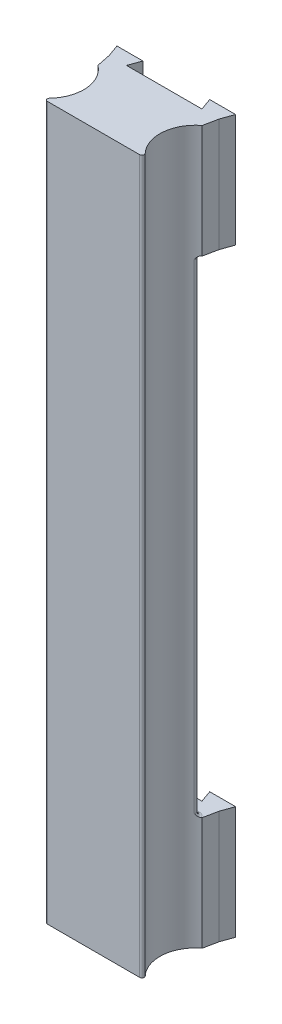
ISO-10303-21;
HEADER;
FILE_DESCRIPTION(('STEP AP214'),'2;1');
FILE_NAME('part.step','',(''),(''),'','','');
FILE_SCHEMA(('AUTOMOTIVE_DESIGN { 1 0 10303 214 1 1 1 1 }'));
ENDSEC;
DATA;
#1=APPLICATION_CONTEXT('core data for automotive mechanical design processes');
#2=APPLICATION_PROTOCOL_DEFINITION('international standard','automotive_design',2000,#1);
#3=PRODUCT_CONTEXT('',#1,'mechanical');
#4=PRODUCT('Part','Part','',(#3));
#5=PRODUCT_RELATED_PRODUCT_CATEGORY('part','',(#4));
#6=PRODUCT_DEFINITION_FORMATION('','',#4);
#7=PRODUCT_DEFINITION_CONTEXT('part definition',#1,'design');
#8=PRODUCT_DEFINITION('design','',#6,#7);
#9=PRODUCT_DEFINITION_SHAPE('','',#8);
#10=(LENGTH_UNIT() NAMED_UNIT(*) SI_UNIT(.MILLI.,.METRE.));
#11=(NAMED_UNIT(*) PLANE_ANGLE_UNIT() SI_UNIT($,.RADIAN.));
#12=(NAMED_UNIT(*) SI_UNIT($,.STERADIAN.) SOLID_ANGLE_UNIT());
#13=UNCERTAINTY_MEASURE_WITH_UNIT(LENGTH_MEASURE(1.E-05),#10,'distance_accuracy_value','');
#14=(GEOMETRIC_REPRESENTATION_CONTEXT(3) GLOBAL_UNCERTAINTY_ASSIGNED_CONTEXT((#13)) GLOBAL_UNIT_ASSIGNED_CONTEXT((#10,
#11,#12)) REPRESENTATION_CONTEXT('',''));
#15=CARTESIAN_POINT('',(0.,0.,0.));
#16=DIRECTION('',(0.,0.,1.));
#17=DIRECTION('',(1.,0.,0.));
#18=AXIS2_PLACEMENT_3D('',#15,#16,#17);
#19=CARTESIAN_POINT('',(-5.24524877236931,21.5,-2.5));
#20=DIRECTION('',(0.,0.,1.));
#21=DIRECTION('',(1.,0.,0.));
#22=AXIS2_PLACEMENT_3D('',#19,#20,#21);
#23=PLANE('',#22);
#24=DIRECTION('',(0.,1.,0.));
#25=VECTOR('',#24,1.);
#26=CARTESIAN_POINT('',(4.085,-22.1229962658299,-2.5));
#27=LINE('',#26,#25);
#28=CARTESIAN_POINT('',(4.085,-21.2,-2.5));
#29=VERTEX_POINT('',#28);
#30=CARTESIAN_POINT('',(4.085,21.2,-2.5));
#31=VERTEX_POINT('',#30);
#32=EDGE_CURVE('E260',#29,#31,#27,.T.);
#33=ORIENTED_EDGE('',*,*,#32,.F.);
#34=DIRECTION('',(1.,0.,0.));
#35=VECTOR('',#34,1.);
#36=CARTESIAN_POINT('',(-4.085,-21.2,-2.5));
#37=LINE('',#36,#35);
#38=CARTESIAN_POINT('',(-4.085,-21.2,-2.5));
#39=VERTEX_POINT('',#38);
#40=EDGE_CURVE('E366',#29,#39,#37,.F.);
#41=ORIENTED_EDGE('',*,*,#40,.T.);
#42=DIRECTION('',(0.,1.,0.));
#43=VECTOR('',#42,1.);
#44=CARTESIAN_POINT('',(-4.085,-22.1229962658299,-2.5));
#45=LINE('',#44,#43);
#46=CARTESIAN_POINT('',(-4.085,21.2,-2.5));
#47=VERTEX_POINT('',#46);
#48=EDGE_CURVE('E688',#39,#47,#45,.T.);
#49=ORIENTED_EDGE('',*,*,#48,.T.);
#50=DIRECTION('',(1.,0.,0.));
#51=VECTOR('',#50,1.);
#52=CARTESIAN_POINT('',(4.085,21.2,-2.5));
#53=LINE('',#52,#51);
#54=EDGE_CURVE('E363',#47,#31,#53,.T.);
#55=ORIENTED_EDGE('',*,*,#54,.T.);
#56=EDGE_LOOP('',(#33,#41,#49,#55));
#57=FACE_BOUND('',#56,.T.);
#58=ADVANCED_FACE('F38',(#57),#23,.F.);
#59=CARTESIAN_POINT('',(-4.60838032363797,31.5,-2.5));
#60=DIRECTION('',(-0.979637559789104,0.,0.200774130431311));
#61=DIRECTION('',(0.200774130431311,0.,0.979637559789104));
#62=AXIS2_PLACEMENT_3D('',#59,#60,#61);
#63=PLANE('',#62);
#64=DIRECTION('',(0.200774130431311,0.,0.979637559789104));
#65=VECTOR('',#64,1.);
#66=CARTESIAN_POINT('',(-4.60838032363797,-21.5,-2.5));
#67=LINE('',#66,#65);
#68=CARTESIAN_POINT('',(-4.86456452210129,-21.5,-3.75));
#69=VERTEX_POINT('',#68);
#70=CARTESIAN_POINT('',(-4.60838032363797,-21.5,-2.5));
#71=VERTEX_POINT('',#70);
#72=EDGE_CURVE('E272',#69,#71,#67,.T.);
#73=ORIENTED_EDGE('',*,*,#72,.F.);
#74=DIRECTION('',(0.,-1.,0.));
#75=VECTOR('',#74,1.);
#76=CARTESIAN_POINT('',(-4.86456452210129,31.5,-3.75));
#77=LINE('',#76,#75);
#78=CARTESIAN_POINT('',(-4.86456452210129,-31.5,-3.75));
#79=VERTEX_POINT('',#78);
#80=EDGE_CURVE('E325',#69,#79,#77,.T.);
#81=ORIENTED_EDGE('',*,*,#80,.T.);
#82=DIRECTION('',(-0.200774130431311,0.,-0.979637559789104));
#83=VECTOR('',#82,1.);
#84=CARTESIAN_POINT('',(-4.60838032363797,-31.5,-2.5));
#85=LINE('',#84,#83);
#86=CARTESIAN_POINT('',(-4.60838032363797,-31.5,-2.5));
#87=VERTEX_POINT('',#86);
#88=EDGE_CURVE('E522',#87,#79,#85,.T.);
#89=ORIENTED_EDGE('',*,*,#88,.F.);
#90=DIRECTION('',(0.,-1.,0.));
#91=VECTOR('',#90,1.);
#92=CARTESIAN_POINT('',(-4.60838032363797,31.5,-2.5));
#93=LINE('',#92,#91);
#94=EDGE_CURVE('E574',#71,#87,#93,.T.);
#95=ORIENTED_EDGE('',*,*,#94,.F.);
#96=EDGE_LOOP('',(#73,#81,#89,#95));
#97=FACE_BOUND('',#96,.T.);
#98=ADVANCED_FACE('F428',(#97),#63,.T.);
#99=CARTESIAN_POINT('',(4.60838032363797,31.5,-2.5));
#100=DIRECTION('',(-0.979637559789105,0.,-0.200774130431308));
#101=DIRECTION('',(-0.200774130431308,0.,0.979637559789105));
#102=AXIS2_PLACEMENT_3D('',#99,#100,#101);
#103=PLANE('',#102);
#104=DIRECTION('',(0.,-1.,0.));
#105=VECTOR('',#104,1.);
#106=CARTESIAN_POINT('',(4.86456452210129,31.5,-3.75));
#107=LINE('',#106,#105);
#108=CARTESIAN_POINT('',(4.86456452210129,-21.5,-3.75));
#109=VERTEX_POINT('',#108);
#110=CARTESIAN_POINT('',(4.86456452210129,-31.5,-3.75));
#111=VERTEX_POINT('',#110);
#112=EDGE_CURVE('E290',#109,#111,#107,.T.);
#113=ORIENTED_EDGE('',*,*,#112,.F.);
#114=DIRECTION('',(-0.200774130431308,0.,0.979637559789105));
#115=VECTOR('',#114,1.);
#116=CARTESIAN_POINT('',(4.60838032363797,-21.5,-2.5));
#117=LINE('',#116,#115);
#118=CARTESIAN_POINT('',(4.60838032363797,-21.5,-2.5));
#119=VERTEX_POINT('',#118);
#120=EDGE_CURVE('E479',#109,#119,#117,.T.);
#121=ORIENTED_EDGE('',*,*,#120,.T.);
#122=DIRECTION('',(0.,-1.,0.));
#123=VECTOR('',#122,1.);
#124=CARTESIAN_POINT('',(4.60838032363797,31.5,-2.5));
#125=LINE('',#124,#123);
#126=CARTESIAN_POINT('',(4.60838032363797,-31.5,-2.5));
#127=VERTEX_POINT('',#126);
#128=EDGE_CURVE('E278',#119,#127,#125,.T.);
#129=ORIENTED_EDGE('',*,*,#128,.T.);
#130=DIRECTION('',(0.200774130431308,0.,-0.979637559789105));
#131=VECTOR('',#130,1.);
#132=CARTESIAN_POINT('',(4.60838032363797,-31.5,-2.5));
#133=LINE('',#132,#131);
#134=EDGE_CURVE('E554',#127,#111,#133,.T.);
#135=ORIENTED_EDGE('',*,*,#134,.T.);
#136=EDGE_LOOP('',(#113,#121,#129,#135));
#137=FACE_BOUND('',#136,.T.);
#138=ADVANCED_FACE('F434',(#137),#103,.F.);
#139=CARTESIAN_POINT('',(5.24524877236931,31.5,-4.81591590075046));
#140=DIRECTION('',(0.941741911594837,0.,0.336336396998157));
#141=DIRECTION('',(0.336336396998157,0.,-0.941741911594837));
#142=AXIS2_PLACEMENT_3D('',#139,#140,#141);
#143=PLANE('',#142);
#144=DIRECTION('',(0.336336396998157,0.,-0.941741911594837));
#145=VECTOR('',#144,1.);
#146=CARTESIAN_POINT('',(5.24524877236931,-21.5,-4.81591590075046));
#147=LINE('',#146,#145);
#148=CARTESIAN_POINT('',(5.24524877236931,-21.5,-4.81591590075046));
#149=VERTEX_POINT('',#148);
#150=EDGE_CURVE('E647',#109,#149,#147,.T.);
#151=ORIENTED_EDGE('',*,*,#150,.F.);
#152=ORIENTED_EDGE('',*,*,#112,.T.);
#153=DIRECTION('',(-0.336336396998157,0.,0.941741911594837));
#154=VECTOR('',#153,1.);
#155=CARTESIAN_POINT('',(5.24524877236931,-31.5,-4.81591590075046));
#156=LINE('',#155,#154);
#157=CARTESIAN_POINT('',(5.24524877236931,-31.5,-4.81591590075046));
#158=VERTEX_POINT('',#157);
#159=EDGE_CURVE('E550',#158,#111,#156,.T.);
#160=ORIENTED_EDGE('',*,*,#159,.F.);
#161=DIRECTION('',(0.,-1.,0.));
#162=VECTOR('',#161,1.);
#163=CARTESIAN_POINT('',(5.24524877236931,31.5,-4.81591590075046));
#164=LINE('',#163,#162);
#165=EDGE_CURVE('E295',#149,#158,#164,.T.);
#166=ORIENTED_EDGE('',*,*,#165,.F.);
#167=EDGE_LOOP('',(#151,#152,#160,#166));
#168=FACE_BOUND('',#167,.T.);
#169=ADVANCED_FACE('F645',(#168),#143,.T.);
#170=CARTESIAN_POINT('',(2.95475122763068,31.5,-4.81591590075046));
#171=DIRECTION('',(0.,0.,-1.));
#172=DIRECTION('',(-1.,0.,0.));
#173=AXIS2_PLACEMENT_3D('',#170,#171,#172);
#174=PLANE('',#173);
#175=DIRECTION('',(1.,0.,0.));
#176=VECTOR('',#175,1.);
#177=CARTESIAN_POINT('',(-5.24524877236931,-21.5,-4.81591590075046));
#178=LINE('',#177,#176);
#179=CARTESIAN_POINT('',(2.95475122763068,-21.5,-4.81591590075046));
#180=VERTEX_POINT('',#179);
#181=EDGE_CURVE('E641',#180,#149,#178,.T.);
#182=ORIENTED_EDGE('',*,*,#181,.T.);
#183=ORIENTED_EDGE('',*,*,#165,.T.);
#184=DIRECTION('',(1.,0.,0.));
#185=VECTOR('',#184,1.);
#186=CARTESIAN_POINT('',(2.95475122763068,-31.5,-4.81591590075046));
#187=LINE('',#186,#185);
#188=CARTESIAN_POINT('',(2.95475122763068,-31.5,-4.81591590075046));
#189=VERTEX_POINT('',#188);
#190=EDGE_CURVE('E546',#189,#158,#187,.T.);
#191=ORIENTED_EDGE('',*,*,#190,.F.);
#192=DIRECTION('',(0.,-1.,0.));
#193=VECTOR('',#192,1.);
#194=CARTESIAN_POINT('',(2.95475122763068,31.5,-4.81591590075046));
#195=LINE('',#194,#193);
#196=EDGE_CURVE('E300',#180,#189,#195,.T.);
#197=ORIENTED_EDGE('',*,*,#196,.F.);
#198=EDGE_LOOP('',(#182,#183,#191,#197));
#199=FACE_BOUND('',#198,.T.);
#200=ADVANCED_FACE('F638',(#199),#174,.T.);
#201=CARTESIAN_POINT('',(3.33543547789871,31.5,-3.75));
#202=DIRECTION('',(-0.941741911594837,0.,0.336336396998157));
#203=DIRECTION('',(0.336336396998157,0.,0.941741911594837));
#204=AXIS2_PLACEMENT_3D('',#201,#202,#203);
#205=PLANE('',#204);
#206=DIRECTION('',(0.336336396998157,0.,0.941741911594837));
#207=VECTOR('',#206,1.);
#208=CARTESIAN_POINT('',(3.33543547789871,-21.5,-3.75));
#209=LINE('',#208,#207);
#210=CARTESIAN_POINT('',(3.33543547789871,-21.5,-3.75));
#211=VERTEX_POINT('',#210);
#212=EDGE_CURVE('E634',#180,#211,#209,.T.);
#213=ORIENTED_EDGE('',*,*,#212,.F.);
#214=ORIENTED_EDGE('',*,*,#196,.T.);
#215=DIRECTION('',(-0.336336396998157,0.,-0.941741911594837));
#216=VECTOR('',#215,1.);
#217=CARTESIAN_POINT('',(3.33543547789871,-31.5,-3.75));
#218=LINE('',#217,#216);
#219=CARTESIAN_POINT('',(3.33543547789871,-31.5,-3.75));
#220=VERTEX_POINT('',#219);
#221=EDGE_CURVE('E542',#220,#189,#218,.T.);
#222=ORIENTED_EDGE('',*,*,#221,.F.);
#223=DIRECTION('',(0.,-1.,0.));
#224=VECTOR('',#223,1.);
#225=CARTESIAN_POINT('',(3.33543547789871,31.5,-3.75));
#226=LINE('',#225,#224);
#227=EDGE_CURVE('E305',#211,#220,#226,.T.);
#228=ORIENTED_EDGE('',*,*,#227,.F.);
#229=EDGE_LOOP('',(#213,#214,#222,#228));
#230=FACE_BOUND('',#229,.T.);
#231=ADVANCED_FACE('F632',(#230),#205,.T.);
#232=CARTESIAN_POINT('',(-3.33543547789871,31.5,-3.75));
#233=DIRECTION('',(0.,0.,-1.));
#234=DIRECTION('',(-1.,0.,0.));
#235=AXIS2_PLACEMENT_3D('',#232,#233,#234);
#236=PLANE('',#235);
#237=DIRECTION('',(-1.,0.,0.));
#238=VECTOR('',#237,1.);
#239=CARTESIAN_POINT('',(-3.33543547789871,-21.5,-3.75));
#240=LINE('',#239,#238);
#241=CARTESIAN_POINT('',(-3.33543547789871,-21.5,-3.75));
#242=VERTEX_POINT('',#241);
#243=EDGE_CURVE('E655',#211,#242,#240,.T.);
#244=ORIENTED_EDGE('',*,*,#243,.F.);
#245=ORIENTED_EDGE('',*,*,#227,.T.);
#246=DIRECTION('',(1.,0.,0.));
#247=VECTOR('',#246,1.);
#248=CARTESIAN_POINT('',(-3.33543547789871,-31.5,-3.75));
#249=LINE('',#248,#247);
#250=CARTESIAN_POINT('',(-3.33543547789871,-31.5,-3.75));
#251=VERTEX_POINT('',#250);
#252=EDGE_CURVE('E538',#251,#220,#249,.T.);
#253=ORIENTED_EDGE('',*,*,#252,.F.);
#254=DIRECTION('',(0.,-1.,0.));
#255=VECTOR('',#254,1.);
#256=CARTESIAN_POINT('',(-3.33543547789871,31.5,-3.75));
#257=LINE('',#256,#255);
#258=EDGE_CURVE('E310',#242,#251,#257,.T.);
#259=ORIENTED_EDGE('',*,*,#258,.F.);
#260=EDGE_LOOP('',(#244,#245,#253,#259));
#261=FACE_BOUND('',#260,.T.);
#262=ADVANCED_FACE('F626',(#261),#236,.T.);
#263=CARTESIAN_POINT('',(-2.95475122763069,31.5,-4.81591590075046));
#264=DIRECTION('',(0.941741911594837,0.,0.336336396998157));
#265=DIRECTION('',(0.336336396998157,0.,-0.941741911594837));
#266=AXIS2_PLACEMENT_3D('',#263,#264,#265);
#267=PLANE('',#266);
#268=DIRECTION('',(0.336336396998157,0.,-0.941741911594837));
#269=VECTOR('',#268,1.);
#270=CARTESIAN_POINT('',(-2.95475122763069,-21.5,-4.81591590075046));
#271=LINE('',#270,#269);
#272=CARTESIAN_POINT('',(-2.95475122763069,-21.5,-4.81591590075046));
#273=VERTEX_POINT('',#272);
#274=EDGE_CURVE('E622',#242,#273,#271,.T.);
#275=ORIENTED_EDGE('',*,*,#274,.F.);
#276=ORIENTED_EDGE('',*,*,#258,.T.);
#277=DIRECTION('',(-0.336336396998157,0.,0.941741911594837));
#278=VECTOR('',#277,1.);
#279=CARTESIAN_POINT('',(-2.95475122763069,-31.5,-4.81591590075046));
#280=LINE('',#279,#278);
#281=CARTESIAN_POINT('',(-2.95475122763069,-31.5,-4.81591590075046));
#282=VERTEX_POINT('',#281);
#283=EDGE_CURVE('E534',#282,#251,#280,.T.);
#284=ORIENTED_EDGE('',*,*,#283,.F.);
#285=DIRECTION('',(0.,-1.,0.));
#286=VECTOR('',#285,1.);
#287=CARTESIAN_POINT('',(-2.95475122763069,31.5,-4.81591590075046));
#288=LINE('',#287,#286);
#289=EDGE_CURVE('E315',#273,#282,#288,.T.);
#290=ORIENTED_EDGE('',*,*,#289,.F.);
#291=EDGE_LOOP('',(#275,#276,#284,#290));
#292=FACE_BOUND('',#291,.T.);
#293=ADVANCED_FACE('F619',(#292),#267,.T.);
#294=CARTESIAN_POINT('',(-5.24524877236931,31.5,-4.81591590075046));
#295=DIRECTION('',(0.,0.,-1.));
#296=DIRECTION('',(-1.,0.,0.));
#297=AXIS2_PLACEMENT_3D('',#294,#295,#296);
#298=PLANE('',#297);
#299=CARTESIAN_POINT('',(-5.24524877236931,-21.5,-4.81591590075046));
#300=VERTEX_POINT('',#299);
#301=EDGE_CURVE('E615',#300,#273,#178,.T.);
#302=ORIENTED_EDGE('',*,*,#301,.T.);
#303=ORIENTED_EDGE('',*,*,#289,.T.);
#304=DIRECTION('',(1.,0.,0.));
#305=VECTOR('',#304,1.);
#306=CARTESIAN_POINT('',(-5.24524877236931,-31.5,-4.81591590075046));
#307=LINE('',#306,#305);
#308=CARTESIAN_POINT('',(-5.24524877236931,-31.5,-4.81591590075046));
#309=VERTEX_POINT('',#308);
#310=EDGE_CURVE('E530',#309,#282,#307,.T.);
#311=ORIENTED_EDGE('',*,*,#310,.F.);
#312=DIRECTION('',(0.,-1.,0.));
#313=VECTOR('',#312,1.);
#314=CARTESIAN_POINT('',(-5.24524877236931,31.5,-4.81591590075046));
#315=LINE('',#314,#313);
#316=EDGE_CURVE('E320',#300,#309,#315,.T.);
#317=ORIENTED_EDGE('',*,*,#316,.F.);
#318=EDGE_LOOP('',(#302,#303,#311,#317));
#319=FACE_BOUND('',#318,.T.);
#320=ADVANCED_FACE('F613',(#319),#298,.T.);
#321=CARTESIAN_POINT('',(-4.86456452210129,31.5,-3.75));
#322=DIRECTION('',(-0.941741911594837,0.,0.336336396998156));
#323=DIRECTION('',(0.336336396998156,0.,0.941741911594838));
#324=AXIS2_PLACEMENT_3D('',#321,#322,#323);
#325=PLANE('',#324);
#326=DIRECTION('',(0.336336396998156,0.,0.941741911594838));
#327=VECTOR('',#326,1.);
#328=CARTESIAN_POINT('',(-4.86456452210129,-21.5,-3.75));
#329=LINE('',#328,#327);
#330=EDGE_CURVE('E329',#300,#69,#329,.T.);
#331=ORIENTED_EDGE('',*,*,#330,.F.);
#332=ORIENTED_EDGE('',*,*,#316,.T.);
#333=DIRECTION('',(-0.336336396998156,0.,-0.941741911594837));
#334=VECTOR('',#333,1.);
#335=CARTESIAN_POINT('',(-4.86456452210129,-31.5,-3.75));
#336=LINE('',#335,#334);
#337=EDGE_CURVE('E526',#79,#309,#336,.T.);
#338=ORIENTED_EDGE('',*,*,#337,.F.);
#339=ORIENTED_EDGE('',*,*,#80,.F.);
#340=EDGE_LOOP('',(#331,#332,#338,#339));
#341=FACE_BOUND('',#340,.T.);
#342=ADVANCED_FACE('F455',(#341),#325,.T.);
#343=DIRECTION('',(-0.200774130431311,0.,-0.979637559789104));
#344=VECTOR('',#343,1.);
#345=CARTESIAN_POINT('',(-4.60838032363797,21.5,-2.5));
#346=LINE('',#345,#344);
#347=CARTESIAN_POINT('',(-4.60838032363796,21.5,-2.5));
#348=VERTEX_POINT('',#347);
#349=CARTESIAN_POINT('',(-4.86456452210129,21.5,-3.75));
#350=VERTEX_POINT('',#349);
#351=EDGE_CURVE('E675',#348,#350,#346,.T.);
#352=ORIENTED_EDGE('',*,*,#351,.F.);
#353=CARTESIAN_POINT('',(-4.60838032363797,31.5,-2.5));
#354=VERTEX_POINT('',#353);
#355=EDGE_CURVE('E330',#354,#348,#93,.T.);
#356=ORIENTED_EDGE('',*,*,#355,.F.);
#357=DIRECTION('',(-0.200774130431311,0.,-0.979637559789104));
#358=VECTOR('',#357,1.);
#359=CARTESIAN_POINT('',(-4.60838032363797,31.5,-2.5));
#360=LINE('',#359,#358);
#361=CARTESIAN_POINT('',(-4.86456452210129,31.5,-3.75));
#362=VERTEX_POINT('',#361);
#363=EDGE_CURVE('E459',#354,#362,#360,.T.);
#364=ORIENTED_EDGE('',*,*,#363,.T.);
#365=EDGE_CURVE('E321',#362,#350,#77,.T.);
#366=ORIENTED_EDGE('',*,*,#365,.T.);
#367=EDGE_LOOP('',(#352,#356,#364,#366));
#368=FACE_BOUND('',#367,.T.);
#369=ADVANCED_FACE('F396',(#368),#63,.T.);
#370=CARTESIAN_POINT('',(-6.5,31.5,0.));
#371=DIRECTION('',(0.,-1.,0.));
#372=DIRECTION('',(0.,0.,-1.));
#373=AXIS2_PLACEMENT_3D('',#370,#371,#372);
#374=CYLINDRICAL_SURFACE('',#373,3.135);
#375=DIRECTION('',(0.,1.,0.));
#376=VECTOR('',#375,1.);
#377=CARTESIAN_POINT('',(-4.22982758620689,-22.1229962658299,-2.16206896551724));
#378=LINE('',#377,#376);
#379=CARTESIAN_POINT('',(-4.22982758620689,-21.2,-2.16206896551724));
#380=VERTEX_POINT('',#379);
#381=CARTESIAN_POINT('',(-4.22982758620689,21.2,-2.16206896551724));
#382=VERTEX_POINT('',#381);
#383=EDGE_CURVE('E261',#380,#382,#378,.T.);
#384=ORIENTED_EDGE('',*,*,#383,.F.);
#385=CARTESIAN_POINT('',(-4.55827298851918,-21.5,-2.4612844640321));
#386=CARTESIAN_POINT('',(-4.54143455661008,-21.5000243216641,-2.44800990043269));
#387=CARTESIAN_POINT('',(-4.52480466585507,-21.4979611893721,-2.43460119558574));
#388=CARTESIAN_POINT('',(-4.49249352260843,-21.4901906143775,-2.40802067472048));
#389=CARTESIAN_POINT('',(-4.47680444527255,-21.4845198297719,-2.39484783075812));
#390=CARTESIAN_POINT('',(-4.443279878637,-21.4684779359178,-2.36616138621974));
#391=CARTESIAN_POINT('',(-4.42571528292319,-21.4573549076767,-2.35075860423749));
#392=CARTESIAN_POINT('',(-4.39243428467488,-21.4314906010558,-2.32096773407384));
#393=CARTESIAN_POINT('',(-4.37672418538867,-21.4167374802418,-2.30658316946893));
#394=CARTESIAN_POINT('',(-4.33609154210771,-21.3726979943336,-2.26869725856682));
#395=CARTESIAN_POINT('',(-4.31300895219961,-21.3407641830028,-2.24637358575372));
#396=CARTESIAN_POINT('',(-4.27028426983801,-21.2734768624102,-2.20397485771387));
#397=CARTESIAN_POINT('',(-4.25065174200985,-21.2381142553406,-2.18390610761256));
#398=CARTESIAN_POINT('',(-4.23081633867057,-21.2018107001358,-2.16310678088176));
#399=CARTESIAN_POINT('',(-4.23032187928477,-21.2009053480206,-2.16258795396965));
#400=CARTESIAN_POINT('',(-4.22982758620689,-21.2,-2.16206896551724));
#401=B_SPLINE_CURVE_WITH_KNOTS('',3,(#385,#386,#387,#388,#389,#390,#391,#392,#393,#394,#395,
#396,#397,#398,#399,#400),.UNSPECIFIED.,.F.,.F.,(4,2,2,2,2,2,2,4),(0.,0.0641026630868594,
0.127564148578601,0.204767905213624,0.282226942548527,0.417304058247702,0.552749935800805,
0.556214037494701),.UNSPECIFIED.);
#402=CARTESIAN_POINT('',(-4.55827298851918,-21.5,-2.4612844640321));
#403=VERTEX_POINT('',#402);
#404=EDGE_CURVE('E369',#380,#403,#401,.F.);
#405=ORIENTED_EDGE('',*,*,#404,.T.);
#406=CARTESIAN_POINT('',(-6.5,-21.5,0.));
#407=DIRECTION('',(0.,-1.,0.));
#408=DIRECTION('',(0.,0.,-1.));
#409=AXIS2_PLACEMENT_3D('',#406,#407,#408);
#410=CIRCLE('',#409,3.135);
#411=EDGE_CURVE('E687',#71,#403,#410,.T.);
#412=ORIENTED_EDGE('',*,*,#411,.F.);
#413=ORIENTED_EDGE('',*,*,#94,.T.);
#414=CARTESIAN_POINT('',(-6.5,-31.5,0.));
#415=DIRECTION('',(0.,-1.,0.));
#416=DIRECTION('',(0.,0.,-1.));
#417=AXIS2_PLACEMENT_3D('',#414,#415,#416);
#418=CIRCLE('',#417,3.135);
#419=CARTESIAN_POINT('',(-4.22982758620689,-31.5,2.16206896551724));
#420=VERTEX_POINT('',#419);
#421=EDGE_CURVE('E469',#87,#420,#418,.T.);
#422=ORIENTED_EDGE('',*,*,#421,.T.);
#423=DIRECTION('',(0.,-1.,0.));
#424=VECTOR('',#423,1.);
#425=CARTESIAN_POINT('',(-4.22982758620689,31.5,2.16206896551724));
#426=LINE('',#425,#424);
#427=CARTESIAN_POINT('',(-4.22982758620689,31.5,2.16206896551724));
#428=VERTEX_POINT('',#427);
#429=EDGE_CURVE('E575',#428,#420,#426,.T.);
#430=ORIENTED_EDGE('',*,*,#429,.F.);
#431=CARTESIAN_POINT('',(-6.5,31.5,0.));
#432=DIRECTION('',(0.,-1.,0.));
#433=DIRECTION('',(0.,0.,-1.));
#434=AXIS2_PLACEMENT_3D('',#431,#432,#433);
#435=CIRCLE('',#434,3.135);
#436=EDGE_CURVE('E462',#354,#428,#435,.T.);
#437=ORIENTED_EDGE('',*,*,#436,.F.);
#438=ORIENTED_EDGE('',*,*,#355,.T.);
#439=CARTESIAN_POINT('',(-6.5,21.5,0.));
#440=DIRECTION('',(0.,1.,0.));
#441=DIRECTION('',(0.,0.,1.));
#442=AXIS2_PLACEMENT_3D('',#439,#440,#441);
#443=CIRCLE('',#442,3.135);
#444=CARTESIAN_POINT('',(-4.55827298851918,21.5,-2.4612844640321));
#445=VERTEX_POINT('',#444);
#446=EDGE_CURVE('E692',#348,#445,#443,.F.);
#447=ORIENTED_EDGE('',*,*,#446,.T.);
#448=CARTESIAN_POINT('',(-4.55827298851918,21.5,-2.4612844640321));
#449=CARTESIAN_POINT('',(-4.54143455661008,21.5000243216641,-2.44800990043269));
#450=CARTESIAN_POINT('',(-4.52480466585507,21.4979611893721,-2.43460119558573));
#451=CARTESIAN_POINT('',(-4.49249352260843,21.4901906143775,-2.40802067472048));
#452=CARTESIAN_POINT('',(-4.47680444527255,21.4845198297719,-2.39484783075812));
#453=CARTESIAN_POINT('',(-4.443279878637,21.4684779359178,-2.36616138621974));
#454=CARTESIAN_POINT('',(-4.42571528292319,21.4573549076767,-2.35075860423749));
#455=CARTESIAN_POINT('',(-4.39243428467488,21.4314906010558,-2.32096773407384));
#456=CARTESIAN_POINT('',(-4.37672418538867,21.4167374802418,-2.30658316946893));
#457=CARTESIAN_POINT('',(-4.33609154210771,21.3726979943336,-2.26869725856682));
#458=CARTESIAN_POINT('',(-4.31300895219961,21.3407641830028,-2.24637358575372));
#459=CARTESIAN_POINT('',(-4.27028426983801,21.2734768624102,-2.20397485771387));
#460=CARTESIAN_POINT('',(-4.25065174200985,21.2381142553406,-2.18390610761256));
#461=CARTESIAN_POINT('',(-4.23081633867057,21.2018107001358,-2.16310678088176));
#462=CARTESIAN_POINT('',(-4.23032187928477,21.2009053480206,-2.16258795396965));
#463=CARTESIAN_POINT('',(-4.22982758620689,21.2,-2.16206896551724));
#464=B_SPLINE_CURVE_WITH_KNOTS('',3,(#448,#449,#450,#451,#452,#453,#454,#455,#456,#457,#458,
#459,#460,#461,#462,#463),.UNSPECIFIED.,.F.,.F.,(4,2,2,2,2,2,2,4),(0.,0.0641026630868606,
0.127564148578601,0.204767905213624,0.282226942548527,0.417304058247701,0.552749935800805,
0.556214037494701),.UNSPECIFIED.);
#465=EDGE_CURVE('E49',#445,#382,#464,.T.);
#466=ORIENTED_EDGE('',*,*,#465,.T.);
#467=EDGE_LOOP('',(#384,#405,#412,#413,#422,#430,#437,#438,#447,#466));
#468=FACE_BOUND('',#467,.T.);
#469=ADVANCED_FACE('F390',(#468),#374,.F.);
#470=CARTESIAN_POINT('',(-4.085,31.5,2.3));
#471=DIRECTION('',(0.,-1.,0.));
#472=DIRECTION('',(0.,0.,-1.));
#473=AXIS2_PLACEMENT_3D('',#470,#471,#472);
#474=CYLINDRICAL_SURFACE('',#473,0.2);
#475=CARTESIAN_POINT('',(-4.085,-31.5,2.3));
#476=DIRECTION('',(0.,-1.,0.));
#477=DIRECTION('',(0.,0.,-1.));
#478=AXIS2_PLACEMENT_3D('',#475,#476,#477);
#479=CIRCLE('',#478,0.2);
#480=CARTESIAN_POINT('',(-4.085,-31.5,2.5));
#481=VERTEX_POINT('',#480);
#482=EDGE_CURVE('E476',#481,#420,#479,.T.);
#483=ORIENTED_EDGE('',*,*,#482,.F.);
#484=DIRECTION('',(0.,-1.,0.));
#485=VECTOR('',#484,1.);
#486=CARTESIAN_POINT('',(-4.085,31.5,2.5));
#487=LINE('',#486,#485);
#488=CARTESIAN_POINT('',(-4.085,31.5,2.5));
#489=VERTEX_POINT('',#488);
#490=EDGE_CURVE('E578',#489,#481,#487,.T.);
#491=ORIENTED_EDGE('',*,*,#490,.F.);
#492=CARTESIAN_POINT('',(-4.085,31.5,2.3));
#493=DIRECTION('',(0.,-1.,0.));
#494=DIRECTION('',(0.,0.,-1.));
#495=AXIS2_PLACEMENT_3D('',#492,#493,#494);
#496=CIRCLE('',#495,0.2);
#497=EDGE_CURVE('E516',#489,#428,#496,.T.);
#498=ORIENTED_EDGE('',*,*,#497,.T.);
#499=ORIENTED_EDGE('',*,*,#429,.T.);
#500=EDGE_LOOP('',(#483,#491,#498,#499));
#501=FACE_BOUND('',#500,.T.);
#502=ADVANCED_FACE('F395',(#501),#474,.T.);
#503=CARTESIAN_POINT('',(-4.085,31.5,2.5));
#504=DIRECTION('',(0.,0.,-1.));
#505=DIRECTION('',(-1.,0.,0.));
#506=AXIS2_PLACEMENT_3D('',#503,#504,#505);
#507=PLANE('',#506);
#508=DIRECTION('',(1.,0.,0.));
#509=VECTOR('',#508,1.);
#510=CARTESIAN_POINT('',(-4.085,-31.5,2.5));
#511=LINE('',#510,#509);
#512=CARTESIAN_POINT('',(4.085,-31.5,2.5));
#513=VERTEX_POINT('',#512);
#514=EDGE_CURVE('E565',#481,#513,#511,.T.);
#515=ORIENTED_EDGE('',*,*,#514,.T.);
#516=DIRECTION('',(0.,-1.,0.));
#517=VECTOR('',#516,1.);
#518=CARTESIAN_POINT('',(4.085,31.5,2.5));
#519=LINE('',#518,#517);
#520=CARTESIAN_POINT('',(4.085,31.5,2.5));
#521=VERTEX_POINT('',#520);
#522=EDGE_CURVE('E283',#521,#513,#519,.T.);
#523=ORIENTED_EDGE('',*,*,#522,.F.);
#524=DIRECTION('',(1.,0.,0.));
#525=VECTOR('',#524,1.);
#526=CARTESIAN_POINT('',(-4.085,31.5,2.5));
#527=LINE('',#526,#525);
#528=EDGE_CURVE('E513',#489,#521,#527,.T.);
#529=ORIENTED_EDGE('',*,*,#528,.F.);
#530=ORIENTED_EDGE('',*,*,#490,.T.);
#531=EDGE_LOOP('',(#515,#523,#529,#530));
#532=FACE_BOUND('',#531,.T.);
#533=ADVANCED_FACE('F596',(#532),#507,.F.);
#534=CARTESIAN_POINT('',(4.085,31.5,2.3));
#535=DIRECTION('',(0.,-1.,0.));
#536=DIRECTION('',(0.,0.,-1.));
#537=AXIS2_PLACEMENT_3D('',#534,#535,#536);
#538=CYLINDRICAL_SURFACE('',#537,0.2);
#539=CARTESIAN_POINT('',(4.085,-31.5,2.3));
#540=DIRECTION('',(0.,1.,0.));
#541=DIRECTION('',(0.,0.,1.));
#542=AXIS2_PLACEMENT_3D('',#539,#540,#541);
#543=CIRCLE('',#542,0.2);
#544=CARTESIAN_POINT('',(4.2298275862069,-31.5,2.16206896551724));
#545=VERTEX_POINT('',#544);
#546=EDGE_CURVE('E562',#513,#545,#543,.T.);
#547=ORIENTED_EDGE('',*,*,#546,.T.);
#548=DIRECTION('',(0.,-1.,0.));
#549=VECTOR('',#548,1.);
#550=CARTESIAN_POINT('',(4.2298275862069,31.5,2.16206896551724));
#551=LINE('',#550,#549);
#552=CARTESIAN_POINT('',(4.2298275862069,31.5,2.16206896551724));
#553=VERTEX_POINT('',#552);
#554=EDGE_CURVE('E277',#553,#545,#551,.T.);
#555=ORIENTED_EDGE('',*,*,#554,.F.);
#556=CARTESIAN_POINT('',(4.085,31.5,2.3));
#557=DIRECTION('',(0.,1.,0.));
#558=DIRECTION('',(0.,0.,1.));
#559=AXIS2_PLACEMENT_3D('',#556,#557,#558);
#560=CIRCLE('',#559,0.2);
#561=EDGE_CURVE('E510',#521,#553,#560,.T.);
#562=ORIENTED_EDGE('',*,*,#561,.F.);
#563=ORIENTED_EDGE('',*,*,#522,.T.);
#564=EDGE_LOOP('',(#547,#555,#562,#563));
#565=FACE_BOUND('',#564,.T.);
#566=ADVANCED_FACE('F586',(#565),#538,.T.);
#567=CARTESIAN_POINT('',(6.5,31.5,0.));
#568=DIRECTION('',(0.,-1.,0.));
#569=DIRECTION('',(0.,0.,-1.));
#570=AXIS2_PLACEMENT_3D('',#567,#568,#569);
#571=CYLINDRICAL_SURFACE('',#570,3.135);
#572=ORIENTED_EDGE('',*,*,#128,.F.);
#573=CARTESIAN_POINT('',(6.5,-21.5,0.));
#574=DIRECTION('',(0.,-1.,0.));
#575=DIRECTION('',(0.,0.,-1.));
#576=AXIS2_PLACEMENT_3D('',#573,#574,#575);
#577=CIRCLE('',#576,3.135);
#578=CARTESIAN_POINT('',(4.55827298851918,-21.5,-2.4612844640321));
#579=VERTEX_POINT('',#578);
#580=EDGE_CURVE('E706',#579,#119,#577,.T.);
#581=ORIENTED_EDGE('',*,*,#580,.F.);
#582=CARTESIAN_POINT('',(4.55827298851918,-21.5,-2.4612844640321));
#583=CARTESIAN_POINT('',(4.54143455661008,-21.5000243216641,-2.44800990043268));
#584=CARTESIAN_POINT('',(4.52480466585507,-21.4979611893721,-2.43460119558573));
#585=CARTESIAN_POINT('',(4.49249352260843,-21.4901906143775,-2.40802067472048));
#586=CARTESIAN_POINT('',(4.47680444527255,-21.4845198297719,-2.39484783075812));
#587=CARTESIAN_POINT('',(4.443279878637,-21.4684779359178,-2.36616138621974));
#588=CARTESIAN_POINT('',(4.42571528292319,-21.4573549076767,-2.35075860423749));
#589=CARTESIAN_POINT('',(4.39243428467488,-21.4314906010558,-2.32096773407384));
#590=CARTESIAN_POINT('',(4.37672418538868,-21.4167374802418,-2.30658316946893));
#591=CARTESIAN_POINT('',(4.33609154210772,-21.3726979943336,-2.26869725856683));
#592=CARTESIAN_POINT('',(4.31300895219962,-21.3407641830028,-2.24637358575373));
#593=CARTESIAN_POINT('',(4.270284269838,-21.2734768624102,-2.20397485771386));
#594=CARTESIAN_POINT('',(4.25065174200983,-21.2381142553406,-2.18390610761252));
#595=CARTESIAN_POINT('',(4.23081633867057,-21.2018107001358,-2.16310678088175));
#596=CARTESIAN_POINT('',(4.23032187928477,-21.2009053480206,-2.16258795396965));
#597=CARTESIAN_POINT('',(4.2298275862069,-21.2,-2.16206896551724));
#598=B_SPLINE_CURVE_WITH_KNOTS('',3,(#582,#583,#584,#585,#586,#587,#588,#589,#590,#591,#592,
#593,#594,#595,#596,#597),.UNSPECIFIED.,.F.,.F.,(4,2,2,2,2,2,2,4),(0.,0.0641026630868633,
0.127564148578602,0.204767905213619,0.282226942548522,0.4173040582477,0.5527499358008,
0.556214037494701),.UNSPECIFIED.);
#599=CARTESIAN_POINT('',(4.2298275862069,-21.2,-2.16206896551724));
#600=VERTEX_POINT('',#599);
#601=EDGE_CURVE('E378',#579,#600,#598,.T.);
#602=ORIENTED_EDGE('',*,*,#601,.T.);
#603=DIRECTION('',(0.,1.,0.));
#604=VECTOR('',#603,1.);
#605=CARTESIAN_POINT('',(4.2298275862069,-22.1229962658299,-2.16206896551724));
#606=LINE('',#605,#604);
#607=CARTESIAN_POINT('',(4.2298275862069,21.2,-2.16206896551724));
#608=VERTEX_POINT('',#607);
#609=EDGE_CURVE('E703',#600,#608,#606,.T.);
#610=ORIENTED_EDGE('',*,*,#609,.T.);
#611=CARTESIAN_POINT('',(4.55827298851918,21.5,-2.4612844640321));
#612=CARTESIAN_POINT('',(4.54143455661008,21.5000243216641,-2.44800990043268));
#613=CARTESIAN_POINT('',(4.52480466585507,21.4979611893721,-2.43460119558573));
#614=CARTESIAN_POINT('',(4.49249352260843,21.4901906143775,-2.40802067472048));
#615=CARTESIAN_POINT('',(4.47680444527255,21.4845198297719,-2.39484783075812));
#616=CARTESIAN_POINT('',(4.443279878637,21.4684779359178,-2.36616138621974));
#617=CARTESIAN_POINT('',(4.42571528292319,21.4573549076767,-2.35075860423749));
#618=CARTESIAN_POINT('',(4.39243428467488,21.4314906010558,-2.32096773407384));
#619=CARTESIAN_POINT('',(4.37672418538868,21.4167374802418,-2.30658316946893));
#620=CARTESIAN_POINT('',(4.33609154210772,21.3726979943336,-2.26869725856683));
#621=CARTESIAN_POINT('',(4.31300895219962,21.3407641830028,-2.24637358575373));
#622=CARTESIAN_POINT('',(4.270284269838,21.2734768624102,-2.20397485771386));
#623=CARTESIAN_POINT('',(4.25065174200983,21.2381142553406,-2.18390610761252));
#624=CARTESIAN_POINT('',(4.23081633867057,21.2018107001358,-2.16310678088175));
#625=CARTESIAN_POINT('',(4.23032187928477,21.2009053480206,-2.16258795396965));
#626=CARTESIAN_POINT('',(4.2298275862069,21.2,-2.16206896551724));
#627=B_SPLINE_CURVE_WITH_KNOTS('',3,(#611,#612,#613,#614,#615,#616,#617,#618,#619,#620,#621,
#622,#623,#624,#625,#626),.UNSPECIFIED.,.F.,.F.,(4,2,2,2,2,2,2,4),(0.,0.064102663086863,
0.127564148578602,0.204767905213618,0.282226942548522,0.417304058247699,0.552749935800799,
0.556214037494701),.UNSPECIFIED.);
#628=CARTESIAN_POINT('',(4.55827298851918,21.5,-2.4612844640321));
#629=VERTEX_POINT('',#628);
#630=EDGE_CURVE('E11',#608,#629,#627,.F.);
#631=ORIENTED_EDGE('',*,*,#630,.T.);
#632=CARTESIAN_POINT('',(6.5,21.5,0.));
#633=DIRECTION('',(0.,1.,0.));
#634=DIRECTION('',(0.,0.,1.));
#635=AXIS2_PLACEMENT_3D('',#632,#633,#634);
#636=CIRCLE('',#635,3.135);
#637=CARTESIAN_POINT('',(4.60838032363797,21.5,-2.5));
#638=VERTEX_POINT('',#637);
#639=EDGE_CURVE('E249',#629,#638,#636,.F.);
#640=ORIENTED_EDGE('',*,*,#639,.T.);
#641=CARTESIAN_POINT('',(4.60838032363797,31.5,-2.5));
#642=VERTEX_POINT('',#641);
#643=EDGE_CURVE('E255',#642,#638,#125,.T.);
#644=ORIENTED_EDGE('',*,*,#643,.F.);
#645=CARTESIAN_POINT('',(6.5,31.5,0.));
#646=DIRECTION('',(0.,-1.,0.));
#647=DIRECTION('',(0.,0.,-1.));
#648=AXIS2_PLACEMENT_3D('',#645,#646,#647);
#649=CIRCLE('',#648,3.135);
#650=EDGE_CURVE('E507',#553,#642,#649,.T.);
#651=ORIENTED_EDGE('',*,*,#650,.F.);
#652=ORIENTED_EDGE('',*,*,#554,.T.);
#653=CARTESIAN_POINT('',(6.5,-31.5,0.));
#654=DIRECTION('',(0.,-1.,0.));
#655=DIRECTION('',(0.,0.,-1.));
#656=AXIS2_PLACEMENT_3D('',#653,#654,#655);
#657=CIRCLE('',#656,3.135);
#658=EDGE_CURVE('E558',#545,#127,#657,.T.);
#659=ORIENTED_EDGE('',*,*,#658,.T.);
#660=EDGE_LOOP('',(#572,#581,#602,#610,#631,#640,#644,#651,#652,#659));
#661=FACE_BOUND('',#660,.T.);
#662=ADVANCED_FACE('F252',(#661),#571,.F.);
#663=ORIENTED_EDGE('',*,*,#643,.T.);
#664=DIRECTION('',(0.200774130431308,0.,-0.979637559789105));
#665=VECTOR('',#664,1.);
#666=CARTESIAN_POINT('',(4.60838032363797,21.5,-2.5));
#667=LINE('',#666,#665);
#668=CARTESIAN_POINT('',(4.86456452210129,21.5,-3.75));
#669=VERTEX_POINT('',#668);
#670=EDGE_CURVE('E264',#638,#669,#667,.T.);
#671=ORIENTED_EDGE('',*,*,#670,.T.);
#672=CARTESIAN_POINT('',(4.86456452210129,31.5,-3.75));
#673=VERTEX_POINT('',#672);
#674=EDGE_CURVE('E285',#673,#669,#107,.T.);
#675=ORIENTED_EDGE('',*,*,#674,.F.);
#676=DIRECTION('',(0.200774130431308,0.,-0.979637559789105));
#677=VECTOR('',#676,1.);
#678=CARTESIAN_POINT('',(4.60838032363797,31.5,-2.5));
#679=LINE('',#678,#677);
#680=EDGE_CURVE('E275',#642,#673,#679,.T.);
#681=ORIENTED_EDGE('',*,*,#680,.F.);
#682=EDGE_LOOP('',(#663,#671,#675,#681));
#683=FACE_BOUND('',#682,.T.);
#684=ADVANCED_FACE('F274',(#683),#103,.F.);
#685=DIRECTION('',(-0.336336396998157,0.,0.941741911594837));
#686=VECTOR('',#685,1.);
#687=CARTESIAN_POINT('',(5.24524877236931,21.5,-4.81591590075046));
#688=LINE('',#687,#686);
#689=CARTESIAN_POINT('',(5.24524877236931,21.5,-4.81591590075046));
#690=VERTEX_POINT('',#689);
#691=EDGE_CURVE('E267',#690,#669,#688,.T.);
#692=ORIENTED_EDGE('',*,*,#691,.F.);
#693=CARTESIAN_POINT('',(5.24524877236931,31.5,-4.81591590075046));
#694=VERTEX_POINT('',#693);
#695=EDGE_CURVE('E291',#694,#690,#164,.T.);
#696=ORIENTED_EDGE('',*,*,#695,.F.);
#697=DIRECTION('',(-0.336336396998157,0.,0.941741911594837));
#698=VECTOR('',#697,1.);
#699=CARTESIAN_POINT('',(5.24524877236931,31.5,-4.81591590075046));
#700=LINE('',#699,#698);
#701=EDGE_CURVE('E501',#694,#673,#700,.T.);
#702=ORIENTED_EDGE('',*,*,#701,.T.);
#703=ORIENTED_EDGE('',*,*,#674,.T.);
#704=EDGE_LOOP('',(#692,#696,#702,#703));
#705=FACE_BOUND('',#704,.T.);
#706=ADVANCED_FACE('F713',(#705),#143,.T.);
#707=DIRECTION('',(1.,0.,0.));
#708=VECTOR('',#707,1.);
#709=CARTESIAN_POINT('',(-5.24524877236931,21.5,-4.81591590075046));
#710=LINE('',#709,#708);
#711=CARTESIAN_POINT('',(2.95475122763068,21.5,-4.81591590075046));
#712=VERTEX_POINT('',#711);
#713=EDGE_CURVE('E681',#712,#690,#710,.T.);
#714=ORIENTED_EDGE('',*,*,#713,.F.);
#715=CARTESIAN_POINT('',(2.95475122763068,31.5,-4.81591590075046));
#716=VERTEX_POINT('',#715);
#717=EDGE_CURVE('E296',#716,#712,#195,.T.);
#718=ORIENTED_EDGE('',*,*,#717,.F.);
#719=DIRECTION('',(1.,0.,0.));
#720=VECTOR('',#719,1.);
#721=CARTESIAN_POINT('',(2.95475122763068,31.5,-4.81591590075046));
#722=LINE('',#721,#720);
#723=EDGE_CURVE('E497',#716,#694,#722,.T.);
#724=ORIENTED_EDGE('',*,*,#723,.T.);
#725=ORIENTED_EDGE('',*,*,#695,.T.);
#726=EDGE_LOOP('',(#714,#718,#724,#725));
#727=FACE_BOUND('',#726,.T.);
#728=ADVANCED_FACE('F714',(#727),#174,.T.);
#729=DIRECTION('',(-0.336336396998157,0.,-0.941741911594837));
#730=VECTOR('',#729,1.);
#731=CARTESIAN_POINT('',(3.33543547789871,21.5,-3.75));
#732=LINE('',#731,#730);
#733=CARTESIAN_POINT('',(3.33543547789871,21.5,-3.75));
#734=VERTEX_POINT('',#733);
#735=EDGE_CURVE('E666',#734,#712,#732,.T.);
#736=ORIENTED_EDGE('',*,*,#735,.F.);
#737=CARTESIAN_POINT('',(3.33543547789871,31.5,-3.75));
#738=VERTEX_POINT('',#737);
#739=EDGE_CURVE('E301',#738,#734,#226,.T.);
#740=ORIENTED_EDGE('',*,*,#739,.F.);
#741=DIRECTION('',(-0.336336396998157,0.,-0.941741911594837));
#742=VECTOR('',#741,1.);
#743=CARTESIAN_POINT('',(3.33543547789871,31.5,-3.75));
#744=LINE('',#743,#742);
#745=EDGE_CURVE('E493',#738,#716,#744,.T.);
#746=ORIENTED_EDGE('',*,*,#745,.T.);
#747=ORIENTED_EDGE('',*,*,#717,.T.);
#748=EDGE_LOOP('',(#736,#740,#746,#747));
#749=FACE_BOUND('',#748,.T.);
#750=ADVANCED_FACE('F719',(#749),#205,.T.);
#751=DIRECTION('',(1.,0.,0.));
#752=VECTOR('',#751,1.);
#753=CARTESIAN_POINT('',(-3.33543547789871,21.5,-3.75));
#754=LINE('',#753,#752);
#755=CARTESIAN_POINT('',(-3.33543547789871,21.5,-3.75));
#756=VERTEX_POINT('',#755);
#757=EDGE_CURVE('E669',#756,#734,#754,.T.);
#758=ORIENTED_EDGE('',*,*,#757,.F.);
#759=CARTESIAN_POINT('',(-3.33543547789871,31.5,-3.75));
#760=VERTEX_POINT('',#759);
#761=EDGE_CURVE('E306',#760,#756,#257,.T.);
#762=ORIENTED_EDGE('',*,*,#761,.F.);
#763=DIRECTION('',(1.,0.,0.));
#764=VECTOR('',#763,1.);
#765=CARTESIAN_POINT('',(-3.33543547789871,31.5,-3.75));
#766=LINE('',#765,#764);
#767=EDGE_CURVE('E489',#760,#738,#766,.T.);
#768=ORIENTED_EDGE('',*,*,#767,.T.);
#769=ORIENTED_EDGE('',*,*,#739,.T.);
#770=EDGE_LOOP('',(#758,#762,#768,#769));
#771=FACE_BOUND('',#770,.T.);
#772=ADVANCED_FACE('F722',(#771),#236,.T.);
#773=DIRECTION('',(-0.336336396998157,0.,0.941741911594837));
#774=VECTOR('',#773,1.);
#775=CARTESIAN_POINT('',(-2.95475122763069,21.5,-4.81591590075046));
#776=LINE('',#775,#774);
#777=CARTESIAN_POINT('',(-2.95475122763069,21.5,-4.81591590075046));
#778=VERTEX_POINT('',#777);
#779=EDGE_CURVE('E672',#778,#756,#776,.T.);
#780=ORIENTED_EDGE('',*,*,#779,.F.);
#781=CARTESIAN_POINT('',(-2.95475122763069,31.5,-4.81591590075046));
#782=VERTEX_POINT('',#781);
#783=EDGE_CURVE('E311',#782,#778,#288,.T.);
#784=ORIENTED_EDGE('',*,*,#783,.F.);
#785=DIRECTION('',(-0.336336396998157,0.,0.941741911594837));
#786=VECTOR('',#785,1.);
#787=CARTESIAN_POINT('',(-2.95475122763069,31.5,-4.81591590075046));
#788=LINE('',#787,#786);
#789=EDGE_CURVE('E485',#782,#760,#788,.T.);
#790=ORIENTED_EDGE('',*,*,#789,.T.);
#791=ORIENTED_EDGE('',*,*,#761,.T.);
#792=EDGE_LOOP('',(#780,#784,#790,#791));
#793=FACE_BOUND('',#792,.T.);
#794=ADVANCED_FACE('F726',(#793),#267,.T.);
#795=CARTESIAN_POINT('',(-5.24524877236931,21.5,-4.81591590075046));
#796=VERTEX_POINT('',#795);
#797=EDGE_CURVE('E678',#796,#778,#710,.T.);
#798=ORIENTED_EDGE('',*,*,#797,.F.);
#799=CARTESIAN_POINT('',(-5.24524877236931,31.5,-4.81591590075046));
#800=VERTEX_POINT('',#799);
#801=EDGE_CURVE('E316',#800,#796,#315,.T.);
#802=ORIENTED_EDGE('',*,*,#801,.F.);
#803=DIRECTION('',(1.,0.,0.));
#804=VECTOR('',#803,1.);
#805=CARTESIAN_POINT('',(-5.24524877236931,31.5,-4.81591590075046));
#806=LINE('',#805,#804);
#807=EDGE_CURVE('E473',#800,#782,#806,.T.);
#808=ORIENTED_EDGE('',*,*,#807,.T.);
#809=ORIENTED_EDGE('',*,*,#783,.T.);
#810=EDGE_LOOP('',(#798,#802,#808,#809));
#811=FACE_BOUND('',#810,.T.);
#812=ADVANCED_FACE('F452',(#811),#298,.T.);
#813=DIRECTION('',(-0.336336396998156,0.,-0.941741911594838));
#814=VECTOR('',#813,1.);
#815=CARTESIAN_POINT('',(-4.86456452210129,21.5,-3.75));
#816=LINE('',#815,#814);
#817=EDGE_CURVE('E326',#350,#796,#816,.T.);
#818=ORIENTED_EDGE('',*,*,#817,.F.);
#819=ORIENTED_EDGE('',*,*,#365,.F.);
#820=DIRECTION('',(-0.336336396998156,0.,-0.941741911594837));
#821=VECTOR('',#820,1.);
#822=CARTESIAN_POINT('',(-4.86456452210129,31.5,-3.75));
#823=LINE('',#822,#821);
#824=EDGE_CURVE('E466',#362,#800,#823,.T.);
#825=ORIENTED_EDGE('',*,*,#824,.T.);
#826=ORIENTED_EDGE('',*,*,#801,.T.);
#827=EDGE_LOOP('',(#818,#819,#825,#826));
#828=FACE_BOUND('',#827,.T.);
#829=ADVANCED_FACE('F445',(#828),#325,.T.);
#830=CARTESIAN_POINT('',(6.5,31.5,0.));
#831=DIRECTION('',(0.,-1.,0.));
#832=DIRECTION('',(0.,0.,-1.));
#833=AXIS2_PLACEMENT_3D('',#830,#831,#832);
#834=PLANE('',#833);
#835=ORIENTED_EDGE('',*,*,#363,.F.);
#836=ORIENTED_EDGE('',*,*,#436,.T.);
#837=ORIENTED_EDGE('',*,*,#497,.F.);
#838=ORIENTED_EDGE('',*,*,#528,.T.);
#839=ORIENTED_EDGE('',*,*,#561,.T.);
#840=ORIENTED_EDGE('',*,*,#650,.T.);
#841=ORIENTED_EDGE('',*,*,#680,.T.);
#842=ORIENTED_EDGE('',*,*,#701,.F.);
#843=ORIENTED_EDGE('',*,*,#723,.F.);
#844=ORIENTED_EDGE('',*,*,#745,.F.);
#845=ORIENTED_EDGE('',*,*,#767,.F.);
#846=ORIENTED_EDGE('',*,*,#789,.F.);
#847=ORIENTED_EDGE('',*,*,#807,.F.);
#848=ORIENTED_EDGE('',*,*,#824,.F.);
#849=EDGE_LOOP('',(#835,#836,#837,#838,#839,#840,#841,#842,#843,#844,#845,#846,#847,#848));
#850=FACE_BOUND('',#849,.T.);
#851=ADVANCED_FACE('F443',(#850),#834,.F.);
#852=CARTESIAN_POINT('',(6.5,-31.5,0.));
#853=DIRECTION('',(0.,-1.,0.));
#854=DIRECTION('',(0.,0.,-1.));
#855=AXIS2_PLACEMENT_3D('',#852,#853,#854);
#856=PLANE('',#855);
#857=ORIENTED_EDGE('',*,*,#88,.T.);
#858=ORIENTED_EDGE('',*,*,#337,.T.);
#859=ORIENTED_EDGE('',*,*,#310,.T.);
#860=ORIENTED_EDGE('',*,*,#283,.T.);
#861=ORIENTED_EDGE('',*,*,#252,.T.);
#862=ORIENTED_EDGE('',*,*,#221,.T.);
#863=ORIENTED_EDGE('',*,*,#190,.T.);
#864=ORIENTED_EDGE('',*,*,#159,.T.);
#865=ORIENTED_EDGE('',*,*,#134,.F.);
#866=ORIENTED_EDGE('',*,*,#658,.F.);
#867=ORIENTED_EDGE('',*,*,#546,.F.);
#868=ORIENTED_EDGE('',*,*,#514,.F.);
#869=ORIENTED_EDGE('',*,*,#482,.T.);
#870=ORIENTED_EDGE('',*,*,#421,.F.);
#871=EDGE_LOOP('',(#857,#858,#859,#860,#861,#862,#863,#864,#865,#866,#867,#868,#869,#870));
#872=FACE_BOUND('',#871,.T.);
#873=ADVANCED_FACE('F398',(#872),#856,.T.);
#874=CARTESIAN_POINT('',(-5.24524877236931,-21.5,-4.81591590075046));
#875=DIRECTION('',(0.,-1.,0.));
#876=DIRECTION('',(0.,0.,-1.));
#877=AXIS2_PLACEMENT_3D('',#874,#875,#876);
#878=PLANE('',#877);
#879=ORIENTED_EDGE('',*,*,#411,.T.);
#880=CARTESIAN_POINT('',(-4.085,-21.5,-2.3));
#881=DIRECTION('',(0.,-1.,0.));
#882=DIRECTION('',(0.,0.,-1.));
#883=AXIS2_PLACEMENT_3D('',#880,#881,#882);
#884=CIRCLE('',#883,0.499999999999999);
#885=CARTESIAN_POINT('',(-4.085,-21.5,-2.8));
#886=VERTEX_POINT('',#885);
#887=EDGE_CURVE('E339',#403,#886,#884,.T.);
#888=ORIENTED_EDGE('',*,*,#887,.T.);
#889=DIRECTION('',(1.,0.,0.));
#890=VECTOR('',#889,1.);
#891=CARTESIAN_POINT('',(4.085,-21.5,-2.8));
#892=LINE('',#891,#890);
#893=CARTESIAN_POINT('',(4.085,-21.5,-2.8));
#894=VERTEX_POINT('',#893);
#895=EDGE_CURVE('E333',#886,#894,#892,.T.);
#896=ORIENTED_EDGE('',*,*,#895,.T.);
#897=CARTESIAN_POINT('',(4.085,-21.5,-2.3));
#898=DIRECTION('',(0.,-1.,0.));
#899=DIRECTION('',(0.,0.,-1.));
#900=AXIS2_PLACEMENT_3D('',#897,#898,#899);
#901=CIRCLE('',#900,0.5);
#902=EDGE_CURVE('E336',#894,#579,#901,.T.);
#903=ORIENTED_EDGE('',*,*,#902,.T.);
#904=ORIENTED_EDGE('',*,*,#580,.T.);
#905=ORIENTED_EDGE('',*,*,#120,.F.);
#906=ORIENTED_EDGE('',*,*,#150,.T.);
#907=ORIENTED_EDGE('',*,*,#181,.F.);
#908=ORIENTED_EDGE('',*,*,#212,.T.);
#909=ORIENTED_EDGE('',*,*,#243,.T.);
#910=ORIENTED_EDGE('',*,*,#274,.T.);
#911=ORIENTED_EDGE('',*,*,#301,.F.);
#912=ORIENTED_EDGE('',*,*,#330,.T.);
#913=ORIENTED_EDGE('',*,*,#72,.T.);
#914=EDGE_LOOP('',(#879,#888,#896,#903,#904,#905,#906,#907,#908,#909,#910,#911,#912,#913));
#915=FACE_BOUND('',#914,.T.);
#916=ADVANCED_FACE('F439',(#915),#878,.F.);
#917=CARTESIAN_POINT('',(-5.24524877236931,21.5,-4.81591590075046));
#918=DIRECTION('',(0.,1.,0.));
#919=DIRECTION('',(0.,0.,1.));
#920=AXIS2_PLACEMENT_3D('',#917,#918,#919);
#921=PLANE('',#920);
#922=DIRECTION('',(1.,0.,0.));
#923=VECTOR('',#922,1.);
#924=CARTESIAN_POINT('',(-4.085,21.5,-2.8));
#925=LINE('',#924,#923);
#926=CARTESIAN_POINT('',(4.085,21.5,-2.8));
#927=VERTEX_POINT('',#926);
#928=CARTESIAN_POINT('',(-4.085,21.5,-2.8));
#929=VERTEX_POINT('',#928);
#930=EDGE_CURVE('E57',#927,#929,#925,.F.);
#931=ORIENTED_EDGE('',*,*,#930,.T.);
#932=CARTESIAN_POINT('',(-4.085,21.5,-2.3));
#933=DIRECTION('',(0.,1.,0.));
#934=DIRECTION('',(0.,0.,1.));
#935=AXIS2_PLACEMENT_3D('',#932,#933,#934);
#936=CIRCLE('',#935,0.499999999999999);
#937=EDGE_CURVE('E360',#929,#445,#936,.T.);
#938=ORIENTED_EDGE('',*,*,#937,.T.);
#939=ORIENTED_EDGE('',*,*,#446,.F.);
#940=ORIENTED_EDGE('',*,*,#351,.T.);
#941=ORIENTED_EDGE('',*,*,#817,.T.);
#942=ORIENTED_EDGE('',*,*,#797,.T.);
#943=ORIENTED_EDGE('',*,*,#779,.T.);
#944=ORIENTED_EDGE('',*,*,#757,.T.);
#945=ORIENTED_EDGE('',*,*,#735,.T.);
#946=ORIENTED_EDGE('',*,*,#713,.T.);
#947=ORIENTED_EDGE('',*,*,#691,.T.);
#948=ORIENTED_EDGE('',*,*,#670,.F.);
#949=ORIENTED_EDGE('',*,*,#639,.F.);
#950=CARTESIAN_POINT('',(4.085,21.5,-2.3));
#951=DIRECTION('',(0.,1.,0.));
#952=DIRECTION('',(0.,0.,1.));
#953=AXIS2_PLACEMENT_3D('',#950,#951,#952);
#954=CIRCLE('',#953,0.5);
#955=EDGE_CURVE('E62',#629,#927,#954,.T.);
#956=ORIENTED_EDGE('',*,*,#955,.T.);
#957=EDGE_LOOP('',(#931,#938,#939,#940,#941,#942,#943,#944,#945,#946,#947,#948,#949,#956));
#958=FACE_BOUND('',#957,.T.);
#959=ADVANCED_FACE('F265',(#958),#921,.F.);
#960=CARTESIAN_POINT('',(-4.085,-22.1229962658299,-2.3));
#961=DIRECTION('',(0.,1.,0.));
#962=DIRECTION('',(0.,0.,1.));
#963=AXIS2_PLACEMENT_3D('',#960,#961,#962);
#964=CYLINDRICAL_SURFACE('',#963,0.199999999999999);
#965=ORIENTED_EDGE('',*,*,#48,.F.);
#966=CARTESIAN_POINT('',(-4.085,-21.2,-2.3));
#967=DIRECTION('',(0.,-1.,0.));
#968=DIRECTION('',(0.,0.,-1.));
#969=AXIS2_PLACEMENT_3D('',#966,#967,#968);
#970=CIRCLE('',#969,0.199999999999999);
#971=EDGE_CURVE('E347',#39,#380,#970,.F.);
#972=ORIENTED_EDGE('',*,*,#971,.T.);
#973=ORIENTED_EDGE('',*,*,#383,.T.);
#974=CARTESIAN_POINT('',(-4.085,21.2,-2.3));
#975=DIRECTION('',(0.,1.,0.));
#976=DIRECTION('',(0.,0.,1.));
#977=AXIS2_PLACEMENT_3D('',#974,#975,#976);
#978=CIRCLE('',#977,0.199999999999999);
#979=EDGE_CURVE('E343',#382,#47,#978,.F.);
#980=ORIENTED_EDGE('',*,*,#979,.T.);
#981=EDGE_LOOP('',(#965,#972,#973,#980));
#982=FACE_BOUND('',#981,.T.);
#983=ADVANCED_FACE('F442',(#982),#964,.T.);
#984=CARTESIAN_POINT('',(4.085,-22.1229962658299,-2.3));
#985=DIRECTION('',(0.,1.,0.));
#986=DIRECTION('',(0.,0.,1.));
#987=AXIS2_PLACEMENT_3D('',#984,#985,#986);
#988=CYLINDRICAL_SURFACE('',#987,0.2);
#989=ORIENTED_EDGE('',*,*,#609,.F.);
#990=CARTESIAN_POINT('',(4.085,-21.2,-2.3));
#991=DIRECTION('',(0.,-1.,0.));
#992=DIRECTION('',(0.,0.,-1.));
#993=AXIS2_PLACEMENT_3D('',#990,#991,#992);
#994=CIRCLE('',#993,0.2);
#995=EDGE_CURVE('E353',#600,#29,#994,.F.);
#996=ORIENTED_EDGE('',*,*,#995,.T.);
#997=ORIENTED_EDGE('',*,*,#32,.T.);
#998=CARTESIAN_POINT('',(4.085,21.2,-2.3));
#999=DIRECTION('',(0.,1.,0.));
#1000=DIRECTION('',(0.,0.,1.));
#1001=AXIS2_PLACEMENT_3D('',#998,#999,#1000);
#1002=CIRCLE('',#1001,0.2);
#1003=EDGE_CURVE('E350',#31,#608,#1002,.F.);
#1004=ORIENTED_EDGE('',*,*,#1003,.T.);
#1005=EDGE_LOOP('',(#989,#996,#997,#1004));
#1006=FACE_BOUND('',#1005,.T.);
#1007=ADVANCED_FACE('F758',(#1006),#988,.T.);
#1008=CARTESIAN_POINT('',(4.085,-21.2,-2.3));
#1009=DIRECTION('',(0.,-1.,0.));
#1010=DIRECTION('',(0.,0.,-1.));
#1011=AXIS2_PLACEMENT_3D('',#1008,#1009,#1010);
#1012=TOROIDAL_SURFACE('',#1011,0.5,0.3);
#1013=ORIENTED_EDGE('',*,*,#601,.F.);
#1014=ORIENTED_EDGE('',*,*,#902,.F.);
#1015=CARTESIAN_POINT('',(4.085,-21.2,-2.8));
#1016=DIRECTION('',(1.,0.,0.));
#1017=DIRECTION('',(0.,0.,-1.));
#1018=AXIS2_PLACEMENT_3D('',#1015,#1016,#1017);
#1019=CIRCLE('',#1018,0.3);
#1020=EDGE_CURVE('E699',#29,#894,#1019,.T.);
#1021=ORIENTED_EDGE('',*,*,#1020,.F.);
#1022=ORIENTED_EDGE('',*,*,#995,.F.);
#1023=EDGE_LOOP('',(#1013,#1014,#1021,#1022));
#1024=FACE_BOUND('',#1023,.T.);
#1025=ADVANCED_FACE('F418',(#1024),#1012,.F.);
#1026=CARTESIAN_POINT('',(-5.24524877236931,-21.2,-2.8));
#1027=DIRECTION('',(-1.,0.,0.));
#1028=DIRECTION('',(0.,0.,1.));
#1029=AXIS2_PLACEMENT_3D('',#1026,#1027,#1028);
#1030=CYLINDRICAL_SURFACE('',#1029,0.3);
#1031=ORIENTED_EDGE('',*,*,#1020,.T.);
#1032=ORIENTED_EDGE('',*,*,#895,.F.);
#1033=CARTESIAN_POINT('',(-4.085,-21.2,-2.8));
#1034=DIRECTION('',(1.,0.,0.));
#1035=DIRECTION('',(0.,0.,-1.));
#1036=AXIS2_PLACEMENT_3D('',#1033,#1034,#1035);
#1037=CIRCLE('',#1036,0.3);
#1038=EDGE_CURVE('E747',#39,#886,#1037,.T.);
#1039=ORIENTED_EDGE('',*,*,#1038,.F.);
#1040=ORIENTED_EDGE('',*,*,#40,.F.);
#1041=EDGE_LOOP('',(#1031,#1032,#1039,#1040));
#1042=FACE_BOUND('',#1041,.T.);
#1043=ADVANCED_FACE('F745',(#1042),#1030,.F.);
#1044=CARTESIAN_POINT('',(-4.085,-21.2,-2.3));
#1045=DIRECTION('',(0.,-1.,0.));
#1046=DIRECTION('',(0.,0.,-1.));
#1047=AXIS2_PLACEMENT_3D('',#1044,#1045,#1046);
#1048=TOROIDAL_SURFACE('',#1047,0.499999999999999,0.3);
#1049=ORIENTED_EDGE('',*,*,#404,.F.);
#1050=ORIENTED_EDGE('',*,*,#971,.F.);
#1051=ORIENTED_EDGE('',*,*,#1038,.T.);
#1052=ORIENTED_EDGE('',*,*,#887,.F.);
#1053=EDGE_LOOP('',(#1049,#1050,#1051,#1052));
#1054=FACE_BOUND('',#1053,.T.);
#1055=ADVANCED_FACE('F386',(#1054),#1048,.F.);
#1056=CARTESIAN_POINT('',(4.085,21.2,-2.3));
#1057=DIRECTION('',(0.,1.,0.));
#1058=DIRECTION('',(0.,0.,1.));
#1059=AXIS2_PLACEMENT_3D('',#1056,#1057,#1058);
#1060=TOROIDAL_SURFACE('',#1059,0.5,0.3);
#1061=ORIENTED_EDGE('',*,*,#630,.F.);
#1062=ORIENTED_EDGE('',*,*,#1003,.F.);
#1063=CARTESIAN_POINT('',(4.085,21.2,-2.8));
#1064=DIRECTION('',(1.,0.,0.));
#1065=DIRECTION('',(0.,0.,-1.));
#1066=AXIS2_PLACEMENT_3D('',#1063,#1064,#1065);
#1067=CIRCLE('',#1066,0.3);
#1068=EDGE_CURVE('E43',#927,#31,#1067,.T.);
#1069=ORIENTED_EDGE('',*,*,#1068,.F.);
#1070=ORIENTED_EDGE('',*,*,#955,.F.);
#1071=EDGE_LOOP('',(#1061,#1062,#1069,#1070));
#1072=FACE_BOUND('',#1071,.T.);
#1073=ADVANCED_FACE('F40',(#1072),#1060,.F.);
#1074=CARTESIAN_POINT('',(-5.24524877236931,21.2,-2.8));
#1075=DIRECTION('',(-1.,0.,0.));
#1076=DIRECTION('',(0.,0.,1.));
#1077=AXIS2_PLACEMENT_3D('',#1074,#1075,#1076);
#1078=CYLINDRICAL_SURFACE('',#1077,0.3);
#1079=ORIENTED_EDGE('',*,*,#1068,.T.);
#1080=ORIENTED_EDGE('',*,*,#54,.F.);
#1081=CARTESIAN_POINT('',(-4.085,21.2,-2.8));
#1082=DIRECTION('',(1.,0.,0.));
#1083=DIRECTION('',(0.,0.,-1.));
#1084=AXIS2_PLACEMENT_3D('',#1081,#1082,#1083);
#1085=CIRCLE('',#1084,0.3);
#1086=EDGE_CURVE('E735',#929,#47,#1085,.T.);
#1087=ORIENTED_EDGE('',*,*,#1086,.F.);
#1088=ORIENTED_EDGE('',*,*,#930,.F.);
#1089=EDGE_LOOP('',(#1079,#1080,#1087,#1088));
#1090=FACE_BOUND('',#1089,.T.);
#1091=ADVANCED_FACE('F416',(#1090),#1078,.F.);
#1092=CARTESIAN_POINT('',(-4.085,21.2,-2.3));
#1093=DIRECTION('',(0.,1.,0.));
#1094=DIRECTION('',(0.,0.,1.));
#1095=AXIS2_PLACEMENT_3D('',#1092,#1093,#1094);
#1096=TOROIDAL_SURFACE('',#1095,0.499999999999999,0.3);
#1097=ORIENTED_EDGE('',*,*,#465,.F.);
#1098=ORIENTED_EDGE('',*,*,#937,.F.);
#1099=ORIENTED_EDGE('',*,*,#1086,.T.);
#1100=ORIENTED_EDGE('',*,*,#979,.F.);
#1101=EDGE_LOOP('',(#1097,#1098,#1099,#1100));
#1102=FACE_BOUND('',#1101,.T.);
#1103=ADVANCED_FACE('F413',(#1102),#1096,.F.);
#1104=CLOSED_SHELL('',(#58,#98,#138,#169,#200,#231,#262,#293,#320,#342,#369,#469,#502,#533,#566,
#662,#684,#706,#728,#750,#772,#794,#812,#829,#851,#873,#916,#959,#983,#1007,#1025,#1043,#1055,
#1073,#1091,#1103));
#1105=MANIFOLD_SOLID_BREP('B2',#1104);
#1106=ADVANCED_BREP_SHAPE_REPRESENTATION('',(#18,#1105),#14);
#1107=SHAPE_DEFINITION_REPRESENTATION(#9,#1106);
ENDSEC;
END-ISO-10303-21;
